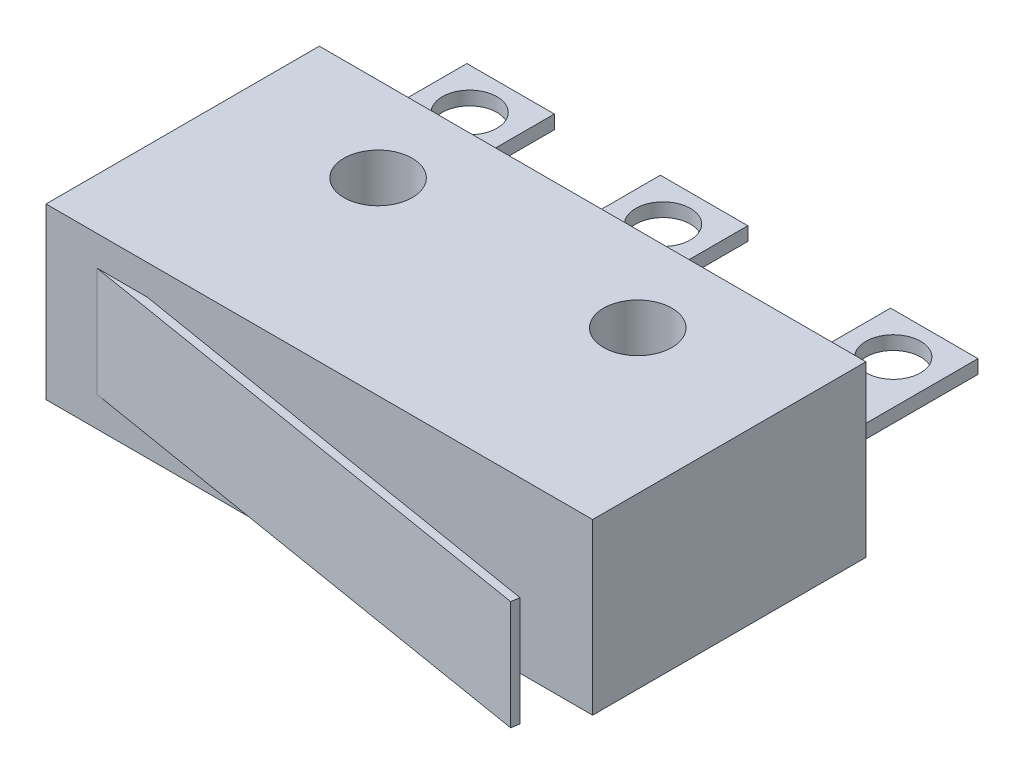
ISO-10303-21;
HEADER;
FILE_DESCRIPTION(('STEP AP214'),'2;1');
FILE_NAME('part.step','',(''),(''),'','','');
FILE_SCHEMA(('AUTOMOTIVE_DESIGN { 1 0 10303 214 1 1 1 1 }'));
ENDSEC;
DATA;
#1=APPLICATION_CONTEXT('core data for automotive mechanical design processes');
#2=APPLICATION_PROTOCOL_DEFINITION('international standard','automotive_design',2000,#1);
#3=PRODUCT_CONTEXT('',#1,'mechanical');
#4=PRODUCT('Part','Part','',(#3));
#5=PRODUCT_RELATED_PRODUCT_CATEGORY('part','',(#4));
#6=PRODUCT_DEFINITION_FORMATION('','',#4);
#7=PRODUCT_DEFINITION_CONTEXT('part definition',#1,'design');
#8=PRODUCT_DEFINITION('design','',#6,#7);
#9=PRODUCT_DEFINITION_SHAPE('','',#8);
#10=(LENGTH_UNIT() NAMED_UNIT(*) SI_UNIT(.MILLI.,.METRE.));
#11=(NAMED_UNIT(*) PLANE_ANGLE_UNIT() SI_UNIT($,.RADIAN.));
#12=(NAMED_UNIT(*) SI_UNIT($,.STERADIAN.) SOLID_ANGLE_UNIT());
#13=UNCERTAINTY_MEASURE_WITH_UNIT(LENGTH_MEASURE(1.E-05),#10,'distance_accuracy_value','');
#14=(GEOMETRIC_REPRESENTATION_CONTEXT(3) GLOBAL_UNCERTAINTY_ASSIGNED_CONTEXT((#13)) GLOBAL_UNIT_ASSIGNED_CONTEXT((#10,
#11,#12)) REPRESENTATION_CONTEXT('',''));
#15=CARTESIAN_POINT('',(0.,0.,0.));
#16=DIRECTION('',(0.,0.,1.));
#17=DIRECTION('',(1.,0.,0.));
#18=AXIS2_PLACEMENT_3D('',#15,#16,#17);
#19=CARTESIAN_POINT('',(-10.,3.1,-5.));
#20=DIRECTION('',(0.,0.,1.));
#21=DIRECTION('',(1.,0.,0.));
#22=AXIS2_PLACEMENT_3D('',#19,#20,#21);
#23=PLANE('',#22);
#24=DIRECTION('',(0.,1.,0.));
#25=VECTOR('',#24,1.);
#26=CARTESIAN_POINT('',(5.9,0.25,-5.));
#27=LINE('',#26,#25);
#28=CARTESIAN_POINT('',(5.9,-0.25,-5.));
#29=VERTEX_POINT('',#28);
#30=CARTESIAN_POINT('',(5.9,0.25,-5.));
#31=VERTEX_POINT('',#30);
#32=EDGE_CURVE('E193',#29,#31,#27,.T.);
#33=ORIENTED_EDGE('',*,*,#32,.F.);
#34=DIRECTION('',(-1.,0.,0.));
#35=VECTOR('',#34,1.);
#36=CARTESIAN_POINT('',(9.1,-0.25,-5.));
#37=LINE('',#36,#35);
#38=CARTESIAN_POINT('',(9.1,-0.25,-5.));
#39=VERTEX_POINT('',#38);
#40=EDGE_CURVE('E206',#39,#29,#37,.T.);
#41=ORIENTED_EDGE('',*,*,#40,.F.);
#42=DIRECTION('',(0.,-1.,0.));
#43=VECTOR('',#42,1.);
#44=CARTESIAN_POINT('',(9.1,0.25,-5.));
#45=LINE('',#44,#43);
#46=CARTESIAN_POINT('',(9.1,0.25,-5.));
#47=VERTEX_POINT('',#46);
#48=EDGE_CURVE('E215',#47,#39,#45,.T.);
#49=ORIENTED_EDGE('',*,*,#48,.F.);
#50=DIRECTION('',(1.,0.,0.));
#51=VECTOR('',#50,1.);
#52=CARTESIAN_POINT('',(9.1,0.25,-5.));
#53=LINE('',#52,#51);
#54=EDGE_CURVE('E196',#31,#47,#53,.T.);
#55=ORIENTED_EDGE('',*,*,#54,.F.);
#56=EDGE_LOOP('',(#33,#41,#49,#55));
#57=FACE_BOUND('',#56,.T.);
#58=DIRECTION('',(-1.,0.,0.));
#59=VECTOR('',#58,1.);
#60=CARTESIAN_POINT('',(-10.,-3.1,-5.));
#61=LINE('',#60,#59);
#62=CARTESIAN_POINT('',(10.,-3.1,-5.));
#63=VERTEX_POINT('',#62);
#64=CARTESIAN_POINT('',(-10.,-3.1,-5.));
#65=VERTEX_POINT('',#64);
#66=EDGE_CURVE('E307',#63,#65,#61,.T.);
#67=ORIENTED_EDGE('',*,*,#66,.T.);
#68=DIRECTION('',(0.,-1.,0.));
#69=VECTOR('',#68,1.);
#70=CARTESIAN_POINT('',(-10.,3.1,-5.));
#71=LINE('',#70,#69);
#72=CARTESIAN_POINT('',(-10.,3.1,-5.));
#73=VERTEX_POINT('',#72);
#74=EDGE_CURVE('E42',#73,#65,#71,.T.);
#75=ORIENTED_EDGE('',*,*,#74,.F.);
#76=DIRECTION('',(-1.,0.,0.));
#77=VECTOR('',#76,1.);
#78=CARTESIAN_POINT('',(-10.,3.1,-5.));
#79=LINE('',#78,#77);
#80=CARTESIAN_POINT('',(10.,3.1,-5.));
#81=VERTEX_POINT('',#80);
#82=EDGE_CURVE('E297',#81,#73,#79,.T.);
#83=ORIENTED_EDGE('',*,*,#82,.F.);
#84=DIRECTION('',(0.,-1.,0.));
#85=VECTOR('',#84,1.);
#86=CARTESIAN_POINT('',(10.,3.1,-5.));
#87=LINE('',#86,#85);
#88=EDGE_CURVE('E11',#81,#63,#87,.T.);
#89=ORIENTED_EDGE('',*,*,#88,.T.);
#90=EDGE_LOOP('',(#67,#75,#83,#89));
#91=FACE_BOUND('',#90,.T.);
#92=DIRECTION('',(0.,1.,0.));
#93=VECTOR('',#92,1.);
#94=CARTESIAN_POINT('',(-2.52199111129902,0.25,-5.));
#95=LINE('',#94,#93);
#96=CARTESIAN_POINT('',(-2.52199111129902,-0.25,-5.));
#97=VERTEX_POINT('',#96);
#98=CARTESIAN_POINT('',(-2.52199111129902,0.25,-5.));
#99=VERTEX_POINT('',#98);
#100=EDGE_CURVE('E231',#97,#99,#95,.T.);
#101=ORIENTED_EDGE('',*,*,#100,.F.);
#102=DIRECTION('',(-1.,0.,0.));
#103=VECTOR('',#102,1.);
#104=CARTESIAN_POINT('',(0.678008888700977,-0.25,-5.));
#105=LINE('',#104,#103);
#106=CARTESIAN_POINT('',(0.678008888700978,-0.25,-5.));
#107=VERTEX_POINT('',#106);
#108=EDGE_CURVE('E236',#107,#97,#105,.T.);
#109=ORIENTED_EDGE('',*,*,#108,.F.);
#110=DIRECTION('',(0.,-1.,0.));
#111=VECTOR('',#110,1.);
#112=CARTESIAN_POINT('',(0.678008888700977,0.25,-5.));
#113=LINE('',#112,#111);
#114=CARTESIAN_POINT('',(0.678008888700976,0.25,-5.));
#115=VERTEX_POINT('',#114);
#116=EDGE_CURVE('E248',#115,#107,#113,.T.);
#117=ORIENTED_EDGE('',*,*,#116,.F.);
#118=DIRECTION('',(1.,0.,0.));
#119=VECTOR('',#118,1.);
#120=CARTESIAN_POINT('',(0.678008888700977,0.25,-5.));
#121=LINE('',#120,#119);
#122=EDGE_CURVE('E245',#99,#115,#121,.T.);
#123=ORIENTED_EDGE('',*,*,#122,.F.);
#124=EDGE_LOOP('',(#101,#109,#117,#123));
#125=FACE_BOUND('',#124,.T.);
#126=DIRECTION('',(0.,1.,0.));
#127=VECTOR('',#126,1.);
#128=CARTESIAN_POINT('',(-9.6,0.25,-5.));
#129=LINE('',#128,#127);
#130=CARTESIAN_POINT('',(-9.6,-0.25,-5.));
#131=VERTEX_POINT('',#130);
#132=CARTESIAN_POINT('',(-9.6,0.25,-5.));
#133=VERTEX_POINT('',#132);
#134=EDGE_CURVE('E192',#131,#133,#129,.T.);
#135=ORIENTED_EDGE('',*,*,#134,.F.);
#136=DIRECTION('',(-1.,0.,0.));
#137=VECTOR('',#136,1.);
#138=CARTESIAN_POINT('',(-6.4,-0.25,-5.));
#139=LINE('',#138,#137);
#140=CARTESIAN_POINT('',(-6.4,-0.25,-5.));
#141=VERTEX_POINT('',#140);
#142=EDGE_CURVE('E189',#141,#131,#139,.T.);
#143=ORIENTED_EDGE('',*,*,#142,.F.);
#144=DIRECTION('',(0.,-1.,0.));
#145=VECTOR('',#144,1.);
#146=CARTESIAN_POINT('',(-6.4,0.25,-5.));
#147=LINE('',#146,#145);
#148=CARTESIAN_POINT('',(-6.4,0.25,-5.));
#149=VERTEX_POINT('',#148);
#150=EDGE_CURVE('E55',#149,#141,#147,.T.);
#151=ORIENTED_EDGE('',*,*,#150,.F.);
#152=DIRECTION('',(1.,0.,0.));
#153=VECTOR('',#152,1.);
#154=CARTESIAN_POINT('',(-6.4,0.25,-5.));
#155=LINE('',#154,#153);
#156=EDGE_CURVE('E50',#133,#149,#155,.T.);
#157=ORIENTED_EDGE('',*,*,#156,.F.);
#158=EDGE_LOOP('',(#135,#143,#151,#157));
#159=FACE_BOUND('',#158,.T.);
#160=ADVANCED_FACE('F33',(#57,#91,#125,#159),#23,.F.);
#161=CARTESIAN_POINT('',(-10.,3.1,5.));
#162=DIRECTION('',(0.,0.,-1.));
#163=DIRECTION('',(-1.,0.,0.));
#164=AXIS2_PLACEMENT_3D('',#161,#162,#163);
#165=PLANE('',#164);
#166=DIRECTION('',(1.,0.,0.));
#167=VECTOR('',#166,1.);
#168=CARTESIAN_POINT('',(-10.,-3.1,5.));
#169=LINE('',#168,#167);
#170=CARTESIAN_POINT('',(-10.,-3.1,5.));
#171=VERTEX_POINT('',#170);
#172=CARTESIAN_POINT('',(10.,-3.1,5.));
#173=VERTEX_POINT('',#172);
#174=EDGE_CURVE('E298',#171,#173,#169,.T.);
#175=ORIENTED_EDGE('',*,*,#174,.T.);
#176=DIRECTION('',(0.,-1.,0.));
#177=VECTOR('',#176,1.);
#178=CARTESIAN_POINT('',(10.,3.1,5.));
#179=LINE('',#178,#177);
#180=CARTESIAN_POINT('',(10.,3.1,5.));
#181=VERTEX_POINT('',#180);
#182=EDGE_CURVE('E304',#181,#173,#179,.T.);
#183=ORIENTED_EDGE('',*,*,#182,.F.);
#184=DIRECTION('',(1.,0.,0.));
#185=VECTOR('',#184,1.);
#186=CARTESIAN_POINT('',(-10.,3.1,5.));
#187=LINE('',#186,#185);
#188=CARTESIAN_POINT('',(-10.,3.1,5.));
#189=VERTEX_POINT('',#188);
#190=EDGE_CURVE('E302',#189,#181,#187,.T.);
#191=ORIENTED_EDGE('',*,*,#190,.F.);
#192=DIRECTION('',(0.,-1.,0.));
#193=VECTOR('',#192,1.);
#194=CARTESIAN_POINT('',(-10.,3.1,5.));
#195=LINE('',#194,#193);
#196=EDGE_CURVE('E314',#189,#171,#195,.T.);
#197=ORIENTED_EDGE('',*,*,#196,.T.);
#198=EDGE_LOOP('',(#175,#183,#191,#197));
#199=FACE_BOUND('',#198,.T.);
#200=DIRECTION('',(-1.,0.,0.));
#201=VECTOR('',#200,1.);
#202=CARTESIAN_POINT('',(-6.30070607553538,2.,5.));
#203=LINE('',#202,#201);
#204=CARTESIAN_POINT('',(-6.30070607553538,2.,5.));
#205=VERTEX_POINT('',#204);
#206=CARTESIAN_POINT('',(-8.1392741809104,2.,5.));
#207=VERTEX_POINT('',#206);
#208=EDGE_CURVE('E265',#205,#207,#203,.T.);
#209=ORIENTED_EDGE('',*,*,#208,.F.);
#210=DIRECTION('',(0.,-1.,0.));
#211=VECTOR('',#210,1.);
#212=CARTESIAN_POINT('',(-6.30070607553538,2.,5.));
#213=LINE('',#212,#211);
#214=CARTESIAN_POINT('',(-6.30070607553538,-2.,5.));
#215=VERTEX_POINT('',#214);
#216=EDGE_CURVE('E275',#205,#215,#213,.T.);
#217=ORIENTED_EDGE('',*,*,#216,.T.);
#218=DIRECTION('',(-1.,0.,0.));
#219=VECTOR('',#218,1.);
#220=CARTESIAN_POINT('',(-6.30070607553538,-2.,5.));
#221=LINE('',#220,#219);
#222=CARTESIAN_POINT('',(-8.1392741809104,-2.,5.));
#223=VERTEX_POINT('',#222);
#224=EDGE_CURVE('E264',#215,#223,#221,.T.);
#225=ORIENTED_EDGE('',*,*,#224,.T.);
#226=DIRECTION('',(0.,-1.,0.));
#227=VECTOR('',#226,1.);
#228=CARTESIAN_POINT('',(-8.1392741809104,2.,5.));
#229=LINE('',#228,#227);
#230=EDGE_CURVE('E291',#207,#223,#229,.T.);
#231=ORIENTED_EDGE('',*,*,#230,.F.);
#232=EDGE_LOOP('',(#209,#217,#225,#231));
#233=FACE_BOUND('',#232,.T.);
#234=ADVANCED_FACE('F366',(#199,#233),#165,.F.);
#235=CARTESIAN_POINT('',(10.,3.1,-5.));
#236=DIRECTION('',(-1.,0.,0.));
#237=DIRECTION('',(0.,0.,1.));
#238=AXIS2_PLACEMENT_3D('',#235,#236,#237);
#239=PLANE('',#238);
#240=DIRECTION('',(0.,0.,-1.));
#241=VECTOR('',#240,1.);
#242=CARTESIAN_POINT('',(10.,-3.1,-5.));
#243=LINE('',#242,#241);
#244=EDGE_CURVE('E293',#173,#63,#243,.T.);
#245=ORIENTED_EDGE('',*,*,#244,.T.);
#246=ORIENTED_EDGE('',*,*,#88,.F.);
#247=DIRECTION('',(0.,0.,-1.));
#248=VECTOR('',#247,1.);
#249=CARTESIAN_POINT('',(10.,3.1,-5.));
#250=LINE('',#249,#248);
#251=EDGE_CURVE('E294',#181,#81,#250,.T.);
#252=ORIENTED_EDGE('',*,*,#251,.F.);
#253=ORIENTED_EDGE('',*,*,#182,.T.);
#254=EDGE_LOOP('',(#245,#246,#252,#253));
#255=FACE_BOUND('',#254,.T.);
#256=ADVANCED_FACE('F35',(#255),#239,.F.);
#257=CARTESIAN_POINT('',(-10.,3.1,-5.));
#258=DIRECTION('',(1.,0.,0.));
#259=DIRECTION('',(0.,0.,-1.));
#260=AXIS2_PLACEMENT_3D('',#257,#258,#259);
#261=PLANE('',#260);
#262=DIRECTION('',(0.,0.,1.));
#263=VECTOR('',#262,1.);
#264=CARTESIAN_POINT('',(-10.,-3.1,-5.));
#265=LINE('',#264,#263);
#266=EDGE_CURVE('E309',#65,#171,#265,.T.);
#267=ORIENTED_EDGE('',*,*,#266,.T.);
#268=ORIENTED_EDGE('',*,*,#196,.F.);
#269=DIRECTION('',(0.,0.,1.));
#270=VECTOR('',#269,1.);
#271=CARTESIAN_POINT('',(-10.,3.1,-5.));
#272=LINE('',#271,#270);
#273=EDGE_CURVE('E300',#73,#189,#272,.T.);
#274=ORIENTED_EDGE('',*,*,#273,.F.);
#275=ORIENTED_EDGE('',*,*,#74,.T.);
#276=EDGE_LOOP('',(#267,#268,#274,#275));
#277=FACE_BOUND('',#276,.T.);
#278=ADVANCED_FACE('F375',(#277),#261,.F.);
#279=CARTESIAN_POINT('',(0.,3.1,0.));
#280=DIRECTION('',(0.,1.,0.));
#281=DIRECTION('',(0.,0.,1.));
#282=AXIS2_PLACEMENT_3D('',#279,#280,#281);
#283=PLANE('',#282);
#284=CARTESIAN_POINT('',(4.75,3.1,-1.9));
#285=DIRECTION('',(0.,1.,0.));
#286=DIRECTION('',(0.,0.,1.));
#287=AXIS2_PLACEMENT_3D('',#284,#285,#286);
#288=CIRCLE('',#287,1.25);
#289=CARTESIAN_POINT('',(4.75,3.1,-0.650000000000002));
#290=VERTEX_POINT('',#289);
#291=EDGE_CURVE('E693',#290,#290,#288,.T.);
#292=ORIENTED_EDGE('',*,*,#291,.F.);
#293=EDGE_LOOP('',(#292));
#294=FACE_BOUND('',#293,.T.);
#295=CARTESIAN_POINT('',(-4.75,3.1,-1.9));
#296=DIRECTION('',(0.,1.,0.));
#297=DIRECTION('',(0.,0.,1.));
#298=AXIS2_PLACEMENT_3D('',#295,#296,#297);
#299=CIRCLE('',#298,1.25);
#300=CARTESIAN_POINT('',(-4.75,3.1,-0.650000000000001));
#301=VERTEX_POINT('',#300);
#302=EDGE_CURVE('E337',#301,#301,#299,.T.);
#303=ORIENTED_EDGE('',*,*,#302,.F.);
#304=EDGE_LOOP('',(#303));
#305=FACE_BOUND('',#304,.T.);
#306=ORIENTED_EDGE('',*,*,#251,.T.);
#307=ORIENTED_EDGE('',*,*,#82,.T.);
#308=ORIENTED_EDGE('',*,*,#273,.T.);
#309=ORIENTED_EDGE('',*,*,#190,.T.);
#310=EDGE_LOOP('',(#306,#307,#308,#309));
#311=FACE_BOUND('',#310,.T.);
#312=ADVANCED_FACE('F377',(#294,#305,#311),#283,.T.);
#313=CARTESIAN_POINT('',(0.,-3.1,0.));
#314=DIRECTION('',(0.,1.,0.));
#315=DIRECTION('',(0.,0.,1.));
#316=AXIS2_PLACEMENT_3D('',#313,#314,#315);
#317=PLANE('',#316);
#318=CARTESIAN_POINT('',(4.75,-3.1,-1.9));
#319=DIRECTION('',(0.,1.,0.));
#320=DIRECTION('',(0.,0.,1.));
#321=AXIS2_PLACEMENT_3D('',#318,#319,#320);
#322=CIRCLE('',#321,1.25);
#323=CARTESIAN_POINT('',(4.75,-3.1,-0.650000000000002));
#324=VERTEX_POINT('',#323);
#325=EDGE_CURVE('E690',#324,#324,#322,.T.);
#326=ORIENTED_EDGE('',*,*,#325,.T.);
#327=EDGE_LOOP('',(#326));
#328=FACE_BOUND('',#327,.T.);
#329=CARTESIAN_POINT('',(-4.75,-3.1,-1.9));
#330=DIRECTION('',(0.,1.,0.));
#331=DIRECTION('',(0.,0.,1.));
#332=AXIS2_PLACEMENT_3D('',#329,#330,#331);
#333=CIRCLE('',#332,1.25);
#334=CARTESIAN_POINT('',(-4.75,-3.1,-0.650000000000001));
#335=VERTEX_POINT('',#334);
#336=EDGE_CURVE('E334',#335,#335,#333,.T.);
#337=ORIENTED_EDGE('',*,*,#336,.T.);
#338=EDGE_LOOP('',(#337));
#339=FACE_BOUND('',#338,.T.);
#340=ORIENTED_EDGE('',*,*,#244,.F.);
#341=ORIENTED_EDGE('',*,*,#174,.F.);
#342=ORIENTED_EDGE('',*,*,#266,.F.);
#343=ORIENTED_EDGE('',*,*,#66,.F.);
#344=EDGE_LOOP('',(#340,#341,#342,#343));
#345=FACE_BOUND('',#344,.T.);
#346=ADVANCED_FACE('F380',(#328,#339,#345),#317,.F.);
#347=CARTESIAN_POINT('',(-8.1392741809104,2.,5.));
#348=DIRECTION('',(0.163170458098859,0.,-0.986597892559987));
#349=DIRECTION('',(-0.986597892559987,0.,-0.163170458098859));
#350=AXIS2_PLACEMENT_3D('',#347,#348,#349);
#351=PLANE('',#350);
#352=DIRECTION('',(0.986597892559987,0.,0.163170458098859));
#353=VECTOR('',#352,1.);
#354=CARTESIAN_POINT('',(-8.1392741809104,-2.,5.));
#355=LINE('',#354,#353);
#356=CARTESIAN_POINT('',(10.,-2.,8.));
#357=VERTEX_POINT('',#356);
#358=EDGE_CURVE('E278',#223,#357,#355,.T.);
#359=ORIENTED_EDGE('',*,*,#358,.T.);
#360=DIRECTION('',(0.,-1.,0.));
#361=VECTOR('',#360,1.);
#362=CARTESIAN_POINT('',(10.,2.,8.));
#363=LINE('',#362,#361);
#364=CARTESIAN_POINT('',(10.,2.,8.));
#365=VERTEX_POINT('',#364);
#366=EDGE_CURVE('E288',#365,#357,#363,.T.);
#367=ORIENTED_EDGE('',*,*,#366,.F.);
#368=DIRECTION('',(0.986597892559987,0.,0.163170458098859));
#369=VECTOR('',#368,1.);
#370=CARTESIAN_POINT('',(-8.1392741809104,2.,5.));
#371=LINE('',#370,#369);
#372=EDGE_CURVE('E268',#207,#365,#371,.T.);
#373=ORIENTED_EDGE('',*,*,#372,.F.);
#374=ORIENTED_EDGE('',*,*,#230,.T.);
#375=EDGE_LOOP('',(#359,#367,#373,#374));
#376=FACE_BOUND('',#375,.T.);
#377=ADVANCED_FACE('F383',(#376),#351,.F.);
#378=CARTESIAN_POINT('',(10.,2.,8.));
#379=DIRECTION('',(-0.98659789255999,0.,-0.163170458098843));
#380=DIRECTION('',(-0.163170458098843,0.,0.98659789255999));
#381=AXIS2_PLACEMENT_3D('',#378,#379,#380);
#382=PLANE('',#381);
#383=DIRECTION('',(0.163170458098843,0.,-0.98659789255999));
#384=VECTOR('',#383,1.);
#385=CARTESIAN_POINT('',(10.,-2.,8.));
#386=LINE('',#385,#384);
#387=CARTESIAN_POINT('',(10.0489511374297,-2.,7.704020632232));
#388=VERTEX_POINT('',#387);
#389=EDGE_CURVE('E280',#357,#388,#386,.T.);
#390=ORIENTED_EDGE('',*,*,#389,.T.);
#391=DIRECTION('',(0.,-1.,0.));
#392=VECTOR('',#391,1.);
#393=CARTESIAN_POINT('',(10.0489511374297,2.,7.704020632232));
#394=LINE('',#393,#392);
#395=CARTESIAN_POINT('',(10.0489511374297,2.,7.704020632232));
#396=VERTEX_POINT('',#395);
#397=EDGE_CURVE('E285',#396,#388,#394,.T.);
#398=ORIENTED_EDGE('',*,*,#397,.F.);
#399=DIRECTION('',(0.163170458098843,0.,-0.98659789255999));
#400=VECTOR('',#399,1.);
#401=CARTESIAN_POINT('',(10.,2.,8.));
#402=LINE('',#401,#400);
#403=EDGE_CURVE('E271',#365,#396,#402,.T.);
#404=ORIENTED_EDGE('',*,*,#403,.F.);
#405=ORIENTED_EDGE('',*,*,#366,.T.);
#406=EDGE_LOOP('',(#390,#398,#404,#405));
#407=FACE_BOUND('',#406,.T.);
#408=ADVANCED_FACE('F390',(#407),#382,.F.);
#409=CARTESIAN_POINT('',(10.0489511374297,2.,7.704020632232));
#410=DIRECTION('',(-0.163170458098859,0.,0.986597892559987));
#411=DIRECTION('',(0.986597892559988,0.,0.163170458098859));
#412=AXIS2_PLACEMENT_3D('',#409,#410,#411);
#413=PLANE('',#412);
#414=DIRECTION('',(-0.986597892559988,0.,-0.163170458098859));
#415=VECTOR('',#414,1.);
#416=CARTESIAN_POINT('',(10.0489511374297,-2.,7.704020632232));
#417=LINE('',#416,#415);
#418=EDGE_CURVE('E269',#388,#215,#417,.T.);
#419=ORIENTED_EDGE('',*,*,#418,.T.);
#420=ORIENTED_EDGE('',*,*,#216,.F.);
#421=DIRECTION('',(-0.986597892559988,0.,-0.163170458098859));
#422=VECTOR('',#421,1.);
#423=CARTESIAN_POINT('',(10.0489511374297,2.,7.704020632232));
#424=LINE('',#423,#422);
#425=EDGE_CURVE('E273',#396,#205,#424,.T.);
#426=ORIENTED_EDGE('',*,*,#425,.F.);
#427=ORIENTED_EDGE('',*,*,#397,.T.);
#428=EDGE_LOOP('',(#419,#420,#426,#427));
#429=FACE_BOUND('',#428,.T.);
#430=ADVANCED_FACE('F394',(#429),#413,.F.);
#431=CARTESIAN_POINT('',(0.,2.,0.));
#432=DIRECTION('',(0.,-1.,0.));
#433=DIRECTION('',(0.,0.,-1.));
#434=AXIS2_PLACEMENT_3D('',#431,#432,#433);
#435=PLANE('',#434);
#436=ORIENTED_EDGE('',*,*,#208,.T.);
#437=ORIENTED_EDGE('',*,*,#372,.T.);
#438=ORIENTED_EDGE('',*,*,#403,.T.);
#439=ORIENTED_EDGE('',*,*,#425,.T.);
#440=EDGE_LOOP('',(#436,#437,#438,#439));
#441=FACE_BOUND('',#440,.T.);
#442=ADVANCED_FACE('F398',(#441),#435,.F.);
#443=CARTESIAN_POINT('',(0.,-2.,0.));
#444=DIRECTION('',(0.,-1.,0.));
#445=DIRECTION('',(0.,0.,-1.));
#446=AXIS2_PLACEMENT_3D('',#443,#444,#445);
#447=PLANE('',#446);
#448=ORIENTED_EDGE('',*,*,#224,.F.);
#449=ORIENTED_EDGE('',*,*,#418,.F.);
#450=ORIENTED_EDGE('',*,*,#389,.F.);
#451=ORIENTED_EDGE('',*,*,#358,.F.);
#452=EDGE_LOOP('',(#448,#449,#450,#451));
#453=FACE_BOUND('',#452,.T.);
#454=ADVANCED_FACE('F400',(#453),#447,.T.);
#455=CARTESIAN_POINT('',(-2.52199111129902,0.25,-10.));
#456=DIRECTION('',(1.,0.,0.));
#457=DIRECTION('',(0.,1.,0.));
#458=AXIS2_PLACEMENT_3D('',#455,#456,#457);
#459=PLANE('',#458);
#460=ORIENTED_EDGE('',*,*,#100,.T.);
#461=DIRECTION('',(0.,0.,1.));
#462=VECTOR('',#461,1.);
#463=CARTESIAN_POINT('',(-2.52199111129902,0.25,-10.));
#464=LINE('',#463,#462);
#465=CARTESIAN_POINT('',(-2.52199111129902,0.25,-10.));
#466=VERTEX_POINT('',#465);
#467=EDGE_CURVE('E261',#466,#99,#464,.T.);
#468=ORIENTED_EDGE('',*,*,#467,.F.);
#469=DIRECTION('',(0.,1.,0.));
#470=VECTOR('',#469,1.);
#471=CARTESIAN_POINT('',(-2.52199111129902,0.25,-10.));
#472=LINE('',#471,#470);
#473=CARTESIAN_POINT('',(-2.52199111129902,-0.25,-10.));
#474=VERTEX_POINT('',#473);
#475=EDGE_CURVE('E232',#474,#466,#472,.T.);
#476=ORIENTED_EDGE('',*,*,#475,.F.);
#477=DIRECTION('',(0.,0.,1.));
#478=VECTOR('',#477,1.);
#479=CARTESIAN_POINT('',(-2.52199111129902,-0.25,-10.));
#480=LINE('',#479,#478);
#481=EDGE_CURVE('E242',#474,#97,#480,.T.);
#482=ORIENTED_EDGE('',*,*,#481,.T.);
#483=EDGE_LOOP('',(#460,#468,#476,#482));
#484=FACE_BOUND('',#483,.T.);
#485=ADVANCED_FACE('F403',(#484),#459,.F.);
#486=CARTESIAN_POINT('',(0.678008888700977,0.25,-10.));
#487=DIRECTION('',(0.,-1.,0.));
#488=DIRECTION('',(0.,0.,-1.));
#489=AXIS2_PLACEMENT_3D('',#486,#487,#488);
#490=PLANE('',#489);
#491=CARTESIAN_POINT('',(-0.921991111299022,0.25,-8.5));
#492=DIRECTION('',(0.,1.,0.));
#493=DIRECTION('',(0.,0.,1.));
#494=AXIS2_PLACEMENT_3D('',#491,#492,#493);
#495=CIRCLE('',#494,1.);
#496=CARTESIAN_POINT('',(-0.921991111299022,0.25,-7.5));
#497=VERTEX_POINT('',#496);
#498=EDGE_CURVE('E321',#497,#497,#495,.T.);
#499=ORIENTED_EDGE('',*,*,#498,.F.);
#500=EDGE_LOOP('',(#499));
#501=FACE_BOUND('',#500,.T.);
#502=ORIENTED_EDGE('',*,*,#122,.T.);
#503=DIRECTION('',(0.,0.,1.));
#504=VECTOR('',#503,1.);
#505=CARTESIAN_POINT('',(0.678008888700977,0.25,-10.));
#506=LINE('',#505,#504);
#507=CARTESIAN_POINT('',(0.678008888700977,0.25,-10.));
#508=VERTEX_POINT('',#507);
#509=EDGE_CURVE('E258',#508,#115,#506,.T.);
#510=ORIENTED_EDGE('',*,*,#509,.F.);
#511=DIRECTION('',(1.,0.,0.));
#512=VECTOR('',#511,1.);
#513=CARTESIAN_POINT('',(0.678008888700977,0.25,-10.));
#514=LINE('',#513,#512);
#515=EDGE_CURVE('E235',#466,#508,#514,.T.);
#516=ORIENTED_EDGE('',*,*,#515,.F.);
#517=ORIENTED_EDGE('',*,*,#467,.T.);
#518=EDGE_LOOP('',(#502,#510,#516,#517));
#519=FACE_BOUND('',#518,.T.);
#520=ADVANCED_FACE('F410',(#501,#519),#490,.F.);
#521=CARTESIAN_POINT('',(0.678008888700977,0.25,-10.));
#522=DIRECTION('',(-1.,0.,0.));
#523=DIRECTION('',(0.,0.,1.));
#524=AXIS2_PLACEMENT_3D('',#521,#522,#523);
#525=PLANE('',#524);
#526=ORIENTED_EDGE('',*,*,#116,.T.);
#527=DIRECTION('',(0.,0.,1.));
#528=VECTOR('',#527,1.);
#529=CARTESIAN_POINT('',(0.678008888700977,-0.25,-10.));
#530=LINE('',#529,#528);
#531=CARTESIAN_POINT('',(0.678008888700977,-0.25,-10.));
#532=VERTEX_POINT('',#531);
#533=EDGE_CURVE('E255',#532,#107,#530,.T.);
#534=ORIENTED_EDGE('',*,*,#533,.F.);
#535=DIRECTION('',(0.,-1.,0.));
#536=VECTOR('',#535,1.);
#537=CARTESIAN_POINT('',(0.678008888700977,0.25,-10.));
#538=LINE('',#537,#536);
#539=EDGE_CURVE('E238',#508,#532,#538,.T.);
#540=ORIENTED_EDGE('',*,*,#539,.F.);
#541=ORIENTED_EDGE('',*,*,#509,.T.);
#542=EDGE_LOOP('',(#526,#534,#540,#541));
#543=FACE_BOUND('',#542,.T.);
#544=ADVANCED_FACE('F414',(#543),#525,.F.);
#545=CARTESIAN_POINT('',(0.678008888700977,-0.25,-10.));
#546=DIRECTION('',(0.,1.,0.));
#547=DIRECTION('',(0.,0.,1.));
#548=AXIS2_PLACEMENT_3D('',#545,#546,#547);
#549=PLANE('',#548);
#550=CARTESIAN_POINT('',(-0.921991111299022,-0.25,-8.5));
#551=DIRECTION('',(0.,1.,0.));
#552=DIRECTION('',(0.,0.,1.));
#553=AXIS2_PLACEMENT_3D('',#550,#551,#552);
#554=CIRCLE('',#553,1.);
#555=CARTESIAN_POINT('',(-0.921991111299022,-0.25,-7.5));
#556=VERTEX_POINT('',#555);
#557=EDGE_CURVE('E319',#556,#556,#554,.T.);
#558=ORIENTED_EDGE('',*,*,#557,.T.);
#559=EDGE_LOOP('',(#558));
#560=FACE_BOUND('',#559,.T.);
#561=ORIENTED_EDGE('',*,*,#108,.T.);
#562=ORIENTED_EDGE('',*,*,#481,.F.);
#563=DIRECTION('',(-1.,0.,0.));
#564=VECTOR('',#563,1.);
#565=CARTESIAN_POINT('',(0.678008888700977,-0.25,-10.));
#566=LINE('',#565,#564);
#567=EDGE_CURVE('E240',#532,#474,#566,.T.);
#568=ORIENTED_EDGE('',*,*,#567,.F.);
#569=ORIENTED_EDGE('',*,*,#533,.T.);
#570=EDGE_LOOP('',(#561,#562,#568,#569));
#571=FACE_BOUND('',#570,.T.);
#572=ADVANCED_FACE('F418',(#560,#571),#549,.F.);
#573=CARTESIAN_POINT('',(0.,0.,-10.));
#574=DIRECTION('',(0.,0.,-1.));
#575=DIRECTION('',(-1.,0.,0.));
#576=AXIS2_PLACEMENT_3D('',#573,#574,#575);
#577=PLANE('',#576);
#578=ORIENTED_EDGE('',*,*,#475,.T.);
#579=ORIENTED_EDGE('',*,*,#515,.T.);
#580=ORIENTED_EDGE('',*,*,#539,.T.);
#581=ORIENTED_EDGE('',*,*,#567,.T.);
#582=EDGE_LOOP('',(#578,#579,#580,#581));
#583=FACE_BOUND('',#582,.T.);
#584=ADVANCED_FACE('F422',(#583),#577,.T.);
#585=CARTESIAN_POINT('',(5.9,0.25,-10.));
#586=DIRECTION('',(1.,0.,0.));
#587=DIRECTION('',(0.,0.,-1.));
#588=AXIS2_PLACEMENT_3D('',#585,#586,#587);
#589=PLANE('',#588);
#590=ORIENTED_EDGE('',*,*,#32,.T.);
#591=DIRECTION('',(0.,0.,1.));
#592=VECTOR('',#591,1.);
#593=CARTESIAN_POINT('',(5.9,0.25,-10.));
#594=LINE('',#593,#592);
#595=CARTESIAN_POINT('',(5.9,0.25,-10.));
#596=VERTEX_POINT('',#595);
#597=EDGE_CURVE('E228',#596,#31,#594,.T.);
#598=ORIENTED_EDGE('',*,*,#597,.F.);
#599=DIRECTION('',(0.,1.,0.));
#600=VECTOR('',#599,1.);
#601=CARTESIAN_POINT('',(5.9,0.25,-10.));
#602=LINE('',#601,#600);
#603=CARTESIAN_POINT('',(5.9,-0.25,-10.));
#604=VERTEX_POINT('',#603);
#605=EDGE_CURVE('E202',#604,#596,#602,.T.);
#606=ORIENTED_EDGE('',*,*,#605,.F.);
#607=DIRECTION('',(0.,0.,1.));
#608=VECTOR('',#607,1.);
#609=CARTESIAN_POINT('',(5.9,-0.25,-10.));
#610=LINE('',#609,#608);
#611=EDGE_CURVE('E211',#604,#29,#610,.T.);
#612=ORIENTED_EDGE('',*,*,#611,.T.);
#613=EDGE_LOOP('',(#590,#598,#606,#612));
#614=FACE_BOUND('',#613,.T.);
#615=ADVANCED_FACE('F426',(#614),#589,.F.);
#616=CARTESIAN_POINT('',(9.1,0.25,-10.));
#617=DIRECTION('',(0.,-1.,0.));
#618=DIRECTION('',(0.,0.,-1.));
#619=AXIS2_PLACEMENT_3D('',#616,#617,#618);
#620=PLANE('',#619);
#621=CARTESIAN_POINT('',(7.5,0.25,-8.5));
#622=DIRECTION('',(0.,1.,0.));
#623=DIRECTION('',(0.,0.,1.));
#624=AXIS2_PLACEMENT_3D('',#621,#622,#623);
#625=CIRCLE('',#624,1.);
#626=CARTESIAN_POINT('',(7.5,0.25,-7.5));
#627=VERTEX_POINT('',#626);
#628=EDGE_CURVE('E329',#627,#627,#625,.T.);
#629=ORIENTED_EDGE('',*,*,#628,.F.);
#630=EDGE_LOOP('',(#629));
#631=FACE_BOUND('',#630,.T.);
#632=ORIENTED_EDGE('',*,*,#54,.T.);
#633=DIRECTION('',(0.,0.,1.));
#634=VECTOR('',#633,1.);
#635=CARTESIAN_POINT('',(9.1,0.25,-10.));
#636=LINE('',#635,#634);
#637=CARTESIAN_POINT('',(9.1,0.25,-10.));
#638=VERTEX_POINT('',#637);
#639=EDGE_CURVE('E225',#638,#47,#636,.T.);
#640=ORIENTED_EDGE('',*,*,#639,.F.);
#641=DIRECTION('',(1.,0.,0.));
#642=VECTOR('',#641,1.);
#643=CARTESIAN_POINT('',(9.1,0.25,-10.));
#644=LINE('',#643,#642);
#645=EDGE_CURVE('E205',#596,#638,#644,.T.);
#646=ORIENTED_EDGE('',*,*,#645,.F.);
#647=ORIENTED_EDGE('',*,*,#597,.T.);
#648=EDGE_LOOP('',(#632,#640,#646,#647));
#649=FACE_BOUND('',#648,.T.);
#650=ADVANCED_FACE('F430',(#631,#649),#620,.F.);
#651=CARTESIAN_POINT('',(9.1,0.25,-10.));
#652=DIRECTION('',(-1.,0.,0.));
#653=DIRECTION('',(0.,0.,1.));
#654=AXIS2_PLACEMENT_3D('',#651,#652,#653);
#655=PLANE('',#654);
#656=ORIENTED_EDGE('',*,*,#48,.T.);
#657=DIRECTION('',(0.,0.,1.));
#658=VECTOR('',#657,1.);
#659=CARTESIAN_POINT('',(9.1,-0.25,-10.));
#660=LINE('',#659,#658);
#661=CARTESIAN_POINT('',(9.1,-0.25,-10.));
#662=VERTEX_POINT('',#661);
#663=EDGE_CURVE('E222',#662,#39,#660,.T.);
#664=ORIENTED_EDGE('',*,*,#663,.F.);
#665=DIRECTION('',(0.,-1.,0.));
#666=VECTOR('',#665,1.);
#667=CARTESIAN_POINT('',(9.1,0.25,-10.));
#668=LINE('',#667,#666);
#669=EDGE_CURVE('E208',#638,#662,#668,.T.);
#670=ORIENTED_EDGE('',*,*,#669,.F.);
#671=ORIENTED_EDGE('',*,*,#639,.T.);
#672=EDGE_LOOP('',(#656,#664,#670,#671));
#673=FACE_BOUND('',#672,.T.);
#674=ADVANCED_FACE('F434',(#673),#655,.F.);
#675=CARTESIAN_POINT('',(9.1,-0.25,-10.));
#676=DIRECTION('',(0.,1.,0.));
#677=DIRECTION('',(0.,0.,1.));
#678=AXIS2_PLACEMENT_3D('',#675,#676,#677);
#679=PLANE('',#678);
#680=CARTESIAN_POINT('',(7.5,-0.25,-8.5));
#681=DIRECTION('',(0.,1.,0.));
#682=DIRECTION('',(0.,0.,1.));
#683=AXIS2_PLACEMENT_3D('',#680,#681,#682);
#684=CIRCLE('',#683,1.);
#685=CARTESIAN_POINT('',(7.5,-0.25,-7.5));
#686=VERTEX_POINT('',#685);
#687=EDGE_CURVE('E37',#686,#686,#684,.T.);
#688=ORIENTED_EDGE('',*,*,#687,.T.);
#689=EDGE_LOOP('',(#688));
#690=FACE_BOUND('',#689,.T.);
#691=ORIENTED_EDGE('',*,*,#40,.T.);
#692=ORIENTED_EDGE('',*,*,#611,.F.);
#693=DIRECTION('',(-1.,0.,0.));
#694=VECTOR('',#693,1.);
#695=CARTESIAN_POINT('',(9.1,-0.25,-10.));
#696=LINE('',#695,#694);
#697=EDGE_CURVE('E210',#662,#604,#696,.T.);
#698=ORIENTED_EDGE('',*,*,#697,.F.);
#699=ORIENTED_EDGE('',*,*,#663,.T.);
#700=EDGE_LOOP('',(#691,#692,#698,#699));
#701=FACE_BOUND('',#700,.T.);
#702=ADVANCED_FACE('F438',(#690,#701),#679,.F.);
#703=CARTESIAN_POINT('',(0.,0.,-10.));
#704=DIRECTION('',(0.,0.,-1.));
#705=DIRECTION('',(-1.,0.,0.));
#706=AXIS2_PLACEMENT_3D('',#703,#704,#705);
#707=PLANE('',#706);
#708=ORIENTED_EDGE('',*,*,#605,.T.);
#709=ORIENTED_EDGE('',*,*,#645,.T.);
#710=ORIENTED_EDGE('',*,*,#669,.T.);
#711=ORIENTED_EDGE('',*,*,#697,.T.);
#712=EDGE_LOOP('',(#708,#709,#710,#711));
#713=FACE_BOUND('',#712,.T.);
#714=ADVANCED_FACE('F442',(#713),#707,.T.);
#715=CARTESIAN_POINT('',(-9.6,0.25,-10.));
#716=DIRECTION('',(1.,0.,0.));
#717=DIRECTION('',(0.,0.,-1.));
#718=AXIS2_PLACEMENT_3D('',#715,#716,#717);
#719=PLANE('',#718);
#720=ORIENTED_EDGE('',*,*,#134,.T.);
#721=DIRECTION('',(0.,0.,1.));
#722=VECTOR('',#721,1.);
#723=CARTESIAN_POINT('',(-9.6,0.25,-10.));
#724=LINE('',#723,#722);
#725=CARTESIAN_POINT('',(-9.6,0.25,-10.));
#726=VERTEX_POINT('',#725);
#727=EDGE_CURVE('E173',#726,#133,#724,.T.);
#728=ORIENTED_EDGE('',*,*,#727,.F.);
#729=DIRECTION('',(0.,1.,0.));
#730=VECTOR('',#729,1.);
#731=CARTESIAN_POINT('',(-9.6,0.25,-10.));
#732=LINE('',#731,#730);
#733=CARTESIAN_POINT('',(-9.6,-0.25,-10.));
#734=VERTEX_POINT('',#733);
#735=EDGE_CURVE('E180',#734,#726,#732,.T.);
#736=ORIENTED_EDGE('',*,*,#735,.F.);
#737=DIRECTION('',(0.,0.,1.));
#738=VECTOR('',#737,1.);
#739=CARTESIAN_POINT('',(-9.6,-0.25,-10.));
#740=LINE('',#739,#738);
#741=EDGE_CURVE('E344',#734,#131,#740,.T.);
#742=ORIENTED_EDGE('',*,*,#741,.T.);
#743=EDGE_LOOP('',(#720,#728,#736,#742));
#744=FACE_BOUND('',#743,.T.);
#745=ADVANCED_FACE('F191',(#744),#719,.F.);
#746=CARTESIAN_POINT('',(-6.4,0.25,-10.));
#747=DIRECTION('',(0.,-1.,0.));
#748=DIRECTION('',(0.,0.,-1.));
#749=AXIS2_PLACEMENT_3D('',#746,#747,#748);
#750=PLANE('',#749);
#751=CARTESIAN_POINT('',(-8.,0.25,-8.5));
#752=DIRECTION('',(0.,1.,0.));
#753=DIRECTION('',(0.,0.,1.));
#754=AXIS2_PLACEMENT_3D('',#751,#752,#753);
#755=CIRCLE('',#754,1.);
#756=CARTESIAN_POINT('',(-8.,0.25,-7.5));
#757=VERTEX_POINT('',#756);
#758=EDGE_CURVE('E324',#757,#757,#755,.T.);
#759=ORIENTED_EDGE('',*,*,#758,.F.);
#760=EDGE_LOOP('',(#759));
#761=FACE_BOUND('',#760,.T.);
#762=ORIENTED_EDGE('',*,*,#156,.T.);
#763=DIRECTION('',(0.,0.,1.));
#764=VECTOR('',#763,1.);
#765=CARTESIAN_POINT('',(-6.4,0.25,-10.));
#766=LINE('',#765,#764);
#767=CARTESIAN_POINT('',(-6.4,0.25,-10.));
#768=VERTEX_POINT('',#767);
#769=EDGE_CURVE('E176',#768,#149,#766,.T.);
#770=ORIENTED_EDGE('',*,*,#769,.F.);
#771=DIRECTION('',(1.,0.,0.));
#772=VECTOR('',#771,1.);
#773=CARTESIAN_POINT('',(-6.4,0.25,-10.));
#774=LINE('',#773,#772);
#775=EDGE_CURVE('E169',#726,#768,#774,.T.);
#776=ORIENTED_EDGE('',*,*,#775,.F.);
#777=ORIENTED_EDGE('',*,*,#727,.T.);
#778=EDGE_LOOP('',(#762,#770,#776,#777));
#779=FACE_BOUND('',#778,.T.);
#780=ADVANCED_FACE('F171',(#761,#779),#750,.F.);
#781=CARTESIAN_POINT('',(-6.4,0.25,-10.));
#782=DIRECTION('',(-1.,0.,0.));
#783=DIRECTION('',(0.,0.,1.));
#784=AXIS2_PLACEMENT_3D('',#781,#782,#783);
#785=PLANE('',#784);
#786=ORIENTED_EDGE('',*,*,#150,.T.);
#787=DIRECTION('',(0.,0.,1.));
#788=VECTOR('',#787,1.);
#789=CARTESIAN_POINT('',(-6.4,-0.25,-10.));
#790=LINE('',#789,#788);
#791=CARTESIAN_POINT('',(-6.4,-0.25,-10.));
#792=VERTEX_POINT('',#791);
#793=EDGE_CURVE('E198',#792,#141,#790,.T.);
#794=ORIENTED_EDGE('',*,*,#793,.F.);
#795=DIRECTION('',(0.,-1.,0.));
#796=VECTOR('',#795,1.);
#797=CARTESIAN_POINT('',(-6.4,0.25,-10.));
#798=LINE('',#797,#796);
#799=EDGE_CURVE('E179',#768,#792,#798,.T.);
#800=ORIENTED_EDGE('',*,*,#799,.F.);
#801=ORIENTED_EDGE('',*,*,#769,.T.);
#802=EDGE_LOOP('',(#786,#794,#800,#801));
#803=FACE_BOUND('',#802,.T.);
#804=ADVANCED_FACE('F355',(#803),#785,.F.);
#805=CARTESIAN_POINT('',(-6.4,-0.25,-10.));
#806=DIRECTION('',(0.,1.,0.));
#807=DIRECTION('',(0.,0.,1.));
#808=AXIS2_PLACEMENT_3D('',#805,#806,#807);
#809=PLANE('',#808);
#810=CARTESIAN_POINT('',(-8.,-0.25,-8.5));
#811=DIRECTION('',(0.,1.,0.));
#812=DIRECTION('',(0.,0.,1.));
#813=AXIS2_PLACEMENT_3D('',#810,#811,#812);
#814=CIRCLE('',#813,1.);
#815=CARTESIAN_POINT('',(-8.,-0.25,-7.5));
#816=VERTEX_POINT('',#815);
#817=EDGE_CURVE('E322',#816,#816,#814,.T.);
#818=ORIENTED_EDGE('',*,*,#817,.T.);
#819=EDGE_LOOP('',(#818));
#820=FACE_BOUND('',#819,.T.);
#821=ORIENTED_EDGE('',*,*,#142,.T.);
#822=ORIENTED_EDGE('',*,*,#741,.F.);
#823=DIRECTION('',(-1.,0.,0.));
#824=VECTOR('',#823,1.);
#825=CARTESIAN_POINT('',(-6.4,-0.25,-10.));
#826=LINE('',#825,#824);
#827=EDGE_CURVE('E185',#792,#734,#826,.T.);
#828=ORIENTED_EDGE('',*,*,#827,.F.);
#829=ORIENTED_EDGE('',*,*,#793,.T.);
#830=EDGE_LOOP('',(#821,#822,#828,#829));
#831=FACE_BOUND('',#830,.T.);
#832=ADVANCED_FACE('F353',(#820,#831),#809,.F.);
#833=CARTESIAN_POINT('',(0.,0.,-10.));
#834=DIRECTION('',(0.,0.,-1.));
#835=DIRECTION('',(-1.,0.,0.));
#836=AXIS2_PLACEMENT_3D('',#833,#834,#835);
#837=PLANE('',#836);
#838=ORIENTED_EDGE('',*,*,#735,.T.);
#839=ORIENTED_EDGE('',*,*,#775,.T.);
#840=ORIENTED_EDGE('',*,*,#799,.T.);
#841=ORIENTED_EDGE('',*,*,#827,.T.);
#842=EDGE_LOOP('',(#838,#839,#840,#841));
#843=FACE_BOUND('',#842,.T.);
#844=ADVANCED_FACE('F183',(#843),#837,.T.);
#845=CARTESIAN_POINT('',(-0.921991111299022,-4.75,-8.5));
#846=DIRECTION('',(0.,1.,0.));
#847=DIRECTION('',(0.,0.,1.));
#848=AXIS2_PLACEMENT_3D('',#845,#846,#847);
#849=CYLINDRICAL_SURFACE('',#848,1.);
#850=ORIENTED_EDGE('',*,*,#498,.T.);
#851=EDGE_LOOP('',(#850));
#852=FACE_BOUND('',#851,.T.);
#853=ORIENTED_EDGE('',*,*,#557,.F.);
#854=EDGE_LOOP('',(#853));
#855=FACE_BOUND('',#854,.T.);
#856=ADVANCED_FACE('F474',(#852,#855),#849,.F.);
#857=CARTESIAN_POINT('',(-8.,-4.75,-8.5));
#858=DIRECTION('',(0.,1.,0.));
#859=DIRECTION('',(0.,0.,1.));
#860=AXIS2_PLACEMENT_3D('',#857,#858,#859);
#861=CYLINDRICAL_SURFACE('',#860,1.);
#862=ORIENTED_EDGE('',*,*,#758,.T.);
#863=EDGE_LOOP('',(#862));
#864=FACE_BOUND('',#863,.T.);
#865=ORIENTED_EDGE('',*,*,#817,.F.);
#866=EDGE_LOOP('',(#865));
#867=FACE_BOUND('',#866,.T.);
#868=ADVANCED_FACE('F479',(#864,#867),#861,.F.);
#869=CARTESIAN_POINT('',(7.5,-4.75,-8.5));
#870=DIRECTION('',(0.,1.,0.));
#871=DIRECTION('',(0.,0.,1.));
#872=AXIS2_PLACEMENT_3D('',#869,#870,#871);
#873=CYLINDRICAL_SURFACE('',#872,1.);
#874=ORIENTED_EDGE('',*,*,#628,.T.);
#875=EDGE_LOOP('',(#874));
#876=FACE_BOUND('',#875,.T.);
#877=ORIENTED_EDGE('',*,*,#687,.F.);
#878=EDGE_LOOP('',(#877));
#879=FACE_BOUND('',#878,.T.);
#880=ADVANCED_FACE('F489',(#876,#879),#873,.F.);
#881=CARTESIAN_POINT('',(-4.75,-3.1,-1.9));
#882=DIRECTION('',(0.,1.,0.));
#883=DIRECTION('',(0.,0.,1.));
#884=AXIS2_PLACEMENT_3D('',#881,#882,#883);
#885=CYLINDRICAL_SURFACE('',#884,1.25);
#886=CARTESIAN_POINT('',(-4.75,-3.1,-0.650000000000001));
#887=CARTESIAN_POINT('',(-4.75,-3.03541666666667,-0.650000000000001));
#888=CARTESIAN_POINT('',(-4.75,-2.97083333333333,-0.650000000000001));
#889=CARTESIAN_POINT('',(-4.75,-2.84166666666667,-0.650000000000001));
#890=CARTESIAN_POINT('',(-4.75,-2.77708333333333,-0.650000000000001));
#891=CARTESIAN_POINT('',(-4.75,-2.64791666666667,-0.650000000000001));
#892=CARTESIAN_POINT('',(-4.75,-2.58333333333333,-0.650000000000001));
#893=CARTESIAN_POINT('',(-4.75,-2.45416666666667,-0.650000000000001));
#894=CARTESIAN_POINT('',(-4.75,-2.38958333333333,-0.650000000000001));
#895=CARTESIAN_POINT('',(-4.75,-2.26041666666667,-0.650000000000001));
#896=CARTESIAN_POINT('',(-4.75,-2.19583333333333,-0.650000000000001));
#897=CARTESIAN_POINT('',(-4.75,-2.06666666666667,-0.650000000000001));
#898=CARTESIAN_POINT('',(-4.75,-2.00208333333333,-0.650000000000001));
#899=CARTESIAN_POINT('',(-4.75,-1.87291666666667,-0.650000000000001));
#900=CARTESIAN_POINT('',(-4.75,-1.80833333333333,-0.650000000000001));
#901=CARTESIAN_POINT('',(-4.75,-1.67916666666667,-0.650000000000001));
#902=CARTESIAN_POINT('',(-4.75,-1.61458333333333,-0.650000000000001));
#903=CARTESIAN_POINT('',(-4.75,-1.48541666666667,-0.650000000000001));
#904=CARTESIAN_POINT('',(-4.75,-1.42083333333333,-0.650000000000001));
#905=CARTESIAN_POINT('',(-4.75,-1.29166666666667,-0.650000000000001));
#906=CARTESIAN_POINT('',(-4.75,-1.22708333333333,-0.650000000000001));
#907=CARTESIAN_POINT('',(-4.75,-1.09791666666667,-0.650000000000001));
#908=CARTESIAN_POINT('',(-4.75,-1.03333333333333,-0.650000000000001));
#909=CARTESIAN_POINT('',(-4.75,-0.904166666666667,-0.650000000000001));
#910=CARTESIAN_POINT('',(-4.75,-0.839583333333334,-0.650000000000001));
#911=CARTESIAN_POINT('',(-4.75,-0.710416666666667,-0.650000000000001));
#912=CARTESIAN_POINT('',(-4.75,-0.645833333333334,-0.650000000000001));
#913=CARTESIAN_POINT('',(-4.75,-0.516666666666667,-0.650000000000001));
#914=CARTESIAN_POINT('',(-4.75,-0.452083333333334,-0.650000000000001));
#915=CARTESIAN_POINT('',(-4.75,-0.322916666666667,-0.650000000000001));
#916=CARTESIAN_POINT('',(-4.75,-0.258333333333334,-0.650000000000001));
#917=CARTESIAN_POINT('',(-4.75,-0.129166666666667,-0.650000000000001));
#918=CARTESIAN_POINT('',(-4.75,-0.0645833333333337,-0.650000000000001));
#919=CARTESIAN_POINT('',(-4.75,0.0645833333333329,-0.650000000000001));
#920=CARTESIAN_POINT('',(-4.75,0.129166666666666,-0.650000000000001));
#921=CARTESIAN_POINT('',(-4.75,0.258333333333333,-0.650000000000001));
#922=CARTESIAN_POINT('',(-4.75,0.322916666666666,-0.650000000000001));
#923=CARTESIAN_POINT('',(-4.75,0.452083333333333,-0.650000000000001));
#924=CARTESIAN_POINT('',(-4.75,0.516666666666666,-0.650000000000001));
#925=CARTESIAN_POINT('',(-4.75,0.645833333333333,-0.650000000000001));
#926=CARTESIAN_POINT('',(-4.75,0.710416666666666,-0.650000000000001));
#927=CARTESIAN_POINT('',(-4.75,0.839583333333333,-0.650000000000001));
#928=CARTESIAN_POINT('',(-4.75,0.904166666666666,-0.650000000000001));
#929=CARTESIAN_POINT('',(-4.75,1.03333333333333,-0.650000000000001));
#930=CARTESIAN_POINT('',(-4.75,1.09791666666667,-0.650000000000001));
#931=CARTESIAN_POINT('',(-4.75,1.22708333333333,-0.650000000000001));
#932=CARTESIAN_POINT('',(-4.75,1.29166666666667,-0.650000000000001));
#933=CARTESIAN_POINT('',(-4.75,1.42083333333333,-0.650000000000001));
#934=CARTESIAN_POINT('',(-4.75,1.48541666666667,-0.650000000000001));
#935=CARTESIAN_POINT('',(-4.75,1.61458333333333,-0.650000000000001));
#936=CARTESIAN_POINT('',(-4.75,1.67916666666667,-0.650000000000001));
#937=CARTESIAN_POINT('',(-4.75,1.80833333333333,-0.650000000000001));
#938=CARTESIAN_POINT('',(-4.75,1.87291666666667,-0.650000000000001));
#939=CARTESIAN_POINT('',(-4.75,2.00208333333333,-0.650000000000001));
#940=CARTESIAN_POINT('',(-4.75,2.06666666666667,-0.650000000000001));
#941=CARTESIAN_POINT('',(-4.75,2.19583333333333,-0.650000000000001));
#942=CARTESIAN_POINT('',(-4.75,2.26041666666667,-0.650000000000001));
#943=CARTESIAN_POINT('',(-4.75,2.38958333333333,-0.650000000000001));
#944=CARTESIAN_POINT('',(-4.75,2.45416666666667,-0.650000000000001));
#945=CARTESIAN_POINT('',(-4.75,2.58333333333333,-0.650000000000001));
#946=CARTESIAN_POINT('',(-4.75,2.64791666666667,-0.650000000000001));
#947=CARTESIAN_POINT('',(-4.75,2.77708333333333,-0.650000000000001));
#948=CARTESIAN_POINT('',(-4.75,2.84166666666667,-0.650000000000001));
#949=CARTESIAN_POINT('',(-4.75,2.97083333333333,-0.650000000000001));
#950=CARTESIAN_POINT('',(-4.75,3.03541666666667,-0.650000000000001));
#951=CARTESIAN_POINT('',(-4.75,3.1,-0.650000000000001));
#952=B_SPLINE_CURVE_WITH_KNOTS('',3,(#886,#887,#888,#889,#890,#891,#892,#893,#894,#895,#896,
#897,#898,#899,#900,#901,#902,#903,#904,#905,#906,#907,#908,#909,#910,#911,#912,#913,#914,#915,
#916,#917,#918,#919,#920,#921,#922,#923,#924,#925,#926,#927,#928,#929,#930,#931,#932,#933,#934,
#935,#936,#937,#938,#939,#940,#941,#942,#943,#944,#945,#946,#947,#948,#949,#950,#951),
.UNSPECIFIED.,.F.,.F.,(4,2,2,2,2,2,2,2,2,2,2,2,2,2,2,2,2,2,2,2,2,2,2,2,2,2,2,2,2,2,2,2,4),(0.,
0.19375,0.3875,0.58125,0.775,0.96875,1.1625,1.35625,1.55,1.74375,1.9375,2.13125,2.325,2.51875,
2.7125,2.90625,3.1,3.29375,3.4875,3.68125,3.875,4.06875,4.2625,4.45625,4.65,4.84375,5.0375,
5.23125,5.425,5.61875,5.8125,6.00625,6.2),.UNSPECIFIED.);
#953=EDGE_CURVE('BSEAM498',#335,#301,#952,.T.);
#954=ORIENTED_EDGE('',*,*,#336,.F.);
#955=ORIENTED_EDGE('',*,*,#302,.T.);
#956=ORIENTED_EDGE('',*,*,#953,.T.);
#957=ORIENTED_EDGE('',*,*,#953,.F.);
#958=EDGE_LOOP('',(#954,#956,#955,#957));
#959=FACE_BOUND('',#958,.T.);
#960=ADVANCED_FACE('F498',(#959),#885,.F.);
#961=CARTESIAN_POINT('',(4.75,-3.1,-1.9));
#962=DIRECTION('',(0.,1.,0.));
#963=DIRECTION('',(0.,0.,1.));
#964=AXIS2_PLACEMENT_3D('',#961,#962,#963);
#965=CYLINDRICAL_SURFACE('',#964,1.25);
#966=CARTESIAN_POINT('',(4.75,-3.1,-0.650000000000002));
#967=CARTESIAN_POINT('',(4.75,-3.03541666666667,-0.650000000000002));
#968=CARTESIAN_POINT('',(4.75,-2.97083333333333,-0.650000000000002));
#969=CARTESIAN_POINT('',(4.75,-2.84166666666667,-0.650000000000002));
#970=CARTESIAN_POINT('',(4.75,-2.77708333333333,-0.650000000000002));
#971=CARTESIAN_POINT('',(4.75,-2.64791666666667,-0.650000000000002));
#972=CARTESIAN_POINT('',(4.75,-2.58333333333333,-0.650000000000002));
#973=CARTESIAN_POINT('',(4.75,-2.45416666666667,-0.650000000000002));
#974=CARTESIAN_POINT('',(4.75,-2.38958333333333,-0.650000000000002));
#975=CARTESIAN_POINT('',(4.75,-2.26041666666667,-0.650000000000002));
#976=CARTESIAN_POINT('',(4.75,-2.19583333333333,-0.650000000000002));
#977=CARTESIAN_POINT('',(4.75,-2.06666666666667,-0.650000000000002));
#978=CARTESIAN_POINT('',(4.75,-2.00208333333333,-0.650000000000002));
#979=CARTESIAN_POINT('',(4.75,-1.87291666666667,-0.650000000000002));
#980=CARTESIAN_POINT('',(4.75,-1.80833333333333,-0.650000000000002));
#981=CARTESIAN_POINT('',(4.75,-1.67916666666667,-0.650000000000002));
#982=CARTESIAN_POINT('',(4.75,-1.61458333333333,-0.650000000000002));
#983=CARTESIAN_POINT('',(4.75,-1.48541666666667,-0.650000000000002));
#984=CARTESIAN_POINT('',(4.75,-1.42083333333333,-0.650000000000002));
#985=CARTESIAN_POINT('',(4.75,-1.29166666666667,-0.650000000000002));
#986=CARTESIAN_POINT('',(4.75,-1.22708333333333,-0.650000000000002));
#987=CARTESIAN_POINT('',(4.75,-1.09791666666667,-0.650000000000002));
#988=CARTESIAN_POINT('',(4.75,-1.03333333333333,-0.650000000000002));
#989=CARTESIAN_POINT('',(4.75,-0.904166666666667,-0.650000000000002));
#990=CARTESIAN_POINT('',(4.75,-0.839583333333334,-0.650000000000002));
#991=CARTESIAN_POINT('',(4.75,-0.710416666666667,-0.650000000000002));
#992=CARTESIAN_POINT('',(4.75,-0.645833333333334,-0.650000000000002));
#993=CARTESIAN_POINT('',(4.75,-0.516666666666667,-0.650000000000002));
#994=CARTESIAN_POINT('',(4.75,-0.452083333333334,-0.650000000000002));
#995=CARTESIAN_POINT('',(4.75,-0.322916666666667,-0.650000000000002));
#996=CARTESIAN_POINT('',(4.75,-0.258333333333334,-0.650000000000002));
#997=CARTESIAN_POINT('',(4.75,-0.129166666666667,-0.650000000000002));
#998=CARTESIAN_POINT('',(4.75,-0.0645833333333337,-0.650000000000002));
#999=CARTESIAN_POINT('',(4.75,0.0645833333333329,-0.650000000000002));
#1000=CARTESIAN_POINT('',(4.75,0.129166666666666,-0.650000000000002));
#1001=CARTESIAN_POINT('',(4.75,0.258333333333333,-0.650000000000002));
#1002=CARTESIAN_POINT('',(4.75,0.322916666666666,-0.650000000000002));
#1003=CARTESIAN_POINT('',(4.75,0.452083333333333,-0.650000000000002));
#1004=CARTESIAN_POINT('',(4.75,0.516666666666666,-0.650000000000002));
#1005=CARTESIAN_POINT('',(4.75,0.645833333333333,-0.650000000000002));
#1006=CARTESIAN_POINT('',(4.75,0.710416666666666,-0.650000000000002));
#1007=CARTESIAN_POINT('',(4.75,0.839583333333333,-0.650000000000002));
#1008=CARTESIAN_POINT('',(4.75,0.904166666666666,-0.650000000000002));
#1009=CARTESIAN_POINT('',(4.75,1.03333333333333,-0.650000000000002));
#1010=CARTESIAN_POINT('',(4.75,1.09791666666667,-0.650000000000002));
#1011=CARTESIAN_POINT('',(4.75,1.22708333333333,-0.650000000000002));
#1012=CARTESIAN_POINT('',(4.75,1.29166666666667,-0.650000000000002));
#1013=CARTESIAN_POINT('',(4.75,1.42083333333333,-0.650000000000002));
#1014=CARTESIAN_POINT('',(4.75,1.48541666666667,-0.650000000000002));
#1015=CARTESIAN_POINT('',(4.75,1.61458333333333,-0.650000000000002));
#1016=CARTESIAN_POINT('',(4.75,1.67916666666667,-0.650000000000002));
#1017=CARTESIAN_POINT('',(4.75,1.80833333333333,-0.650000000000002));
#1018=CARTESIAN_POINT('',(4.75,1.87291666666667,-0.650000000000002));
#1019=CARTESIAN_POINT('',(4.75,2.00208333333333,-0.650000000000002));
#1020=CARTESIAN_POINT('',(4.75,2.06666666666667,-0.650000000000002));
#1021=CARTESIAN_POINT('',(4.75,2.19583333333333,-0.650000000000002));
#1022=CARTESIAN_POINT('',(4.75,2.26041666666667,-0.650000000000002));
#1023=CARTESIAN_POINT('',(4.75,2.38958333333333,-0.650000000000002));
#1024=CARTESIAN_POINT('',(4.75,2.45416666666667,-0.650000000000002));
#1025=CARTESIAN_POINT('',(4.75,2.58333333333333,-0.650000000000002));
#1026=CARTESIAN_POINT('',(4.75,2.64791666666667,-0.650000000000002));
#1027=CARTESIAN_POINT('',(4.75,2.77708333333333,-0.650000000000002));
#1028=CARTESIAN_POINT('',(4.75,2.84166666666667,-0.650000000000002));
#1029=CARTESIAN_POINT('',(4.75,2.97083333333333,-0.650000000000002));
#1030=CARTESIAN_POINT('',(4.75,3.03541666666667,-0.650000000000002));
#1031=CARTESIAN_POINT('',(4.75,3.1,-0.650000000000002));
#1032=B_SPLINE_CURVE_WITH_KNOTS('',3,(#966,#967,#968,#969,#970,#971,#972,#973,#974,#975,#976,
#977,#978,#979,#980,#981,#982,#983,#984,#985,#986,#987,#988,#989,#990,#991,#992,#993,#994,#995,
#996,#997,#998,#999,#1000,#1001,#1002,#1003,#1004,#1005,#1006,#1007,#1008,#1009,#1010,#1011,
#1012,#1013,#1014,#1015,#1016,#1017,#1018,#1019,#1020,#1021,#1022,#1023,#1024,#1025,#1026,#1027,
#1028,#1029,#1030,#1031),.UNSPECIFIED.,.F.,.F.,(4,2,2,2,2,2,2,2,2,2,2,2,2,2,2,2,2,2,2,2,2,2,2,2,
2,2,2,2,2,2,2,2,4),(0.,0.19375,0.3875,0.58125,0.775,0.96875,1.1625,1.35625,1.55,1.74375,1.9375,
2.13125,2.325,2.51875,2.7125,2.90625,3.1,3.29375,3.4875,3.68125,3.875,4.06875,4.2625,4.45625,
4.65,4.84375,5.0375,5.23125,5.425,5.61875,5.8125,6.00625,6.2),.UNSPECIFIED.);
#1033=EDGE_CURVE('BSEAM522',#324,#290,#1032,.T.);
#1034=ORIENTED_EDGE('',*,*,#325,.F.);
#1035=ORIENTED_EDGE('',*,*,#291,.T.);
#1036=ORIENTED_EDGE('',*,*,#1033,.T.);
#1037=ORIENTED_EDGE('',*,*,#1033,.F.);
#1038=EDGE_LOOP('',(#1034,#1036,#1035,#1037));
#1039=FACE_BOUND('',#1038,.T.);
#1040=ADVANCED_FACE('F522',(#1039),#965,.F.);
#1041=CLOSED_SHELL('',(#160,#234,#256,#278,#312,#346,#377,#408,#430,#442,#454,#485,#520,#544,
#572,#584,#615,#650,#674,#702,#714,#745,#780,#804,#832,#844,#856,#868,#880,#960,#1040));
#1042=MANIFOLD_SOLID_BREP('B2',#1041);
#1043=ADVANCED_BREP_SHAPE_REPRESENTATION('',(#18,#1042),#14);
#1044=SHAPE_DEFINITION_REPRESENTATION(#9,#1043);
ENDSEC;
END-ISO-10303-21;
